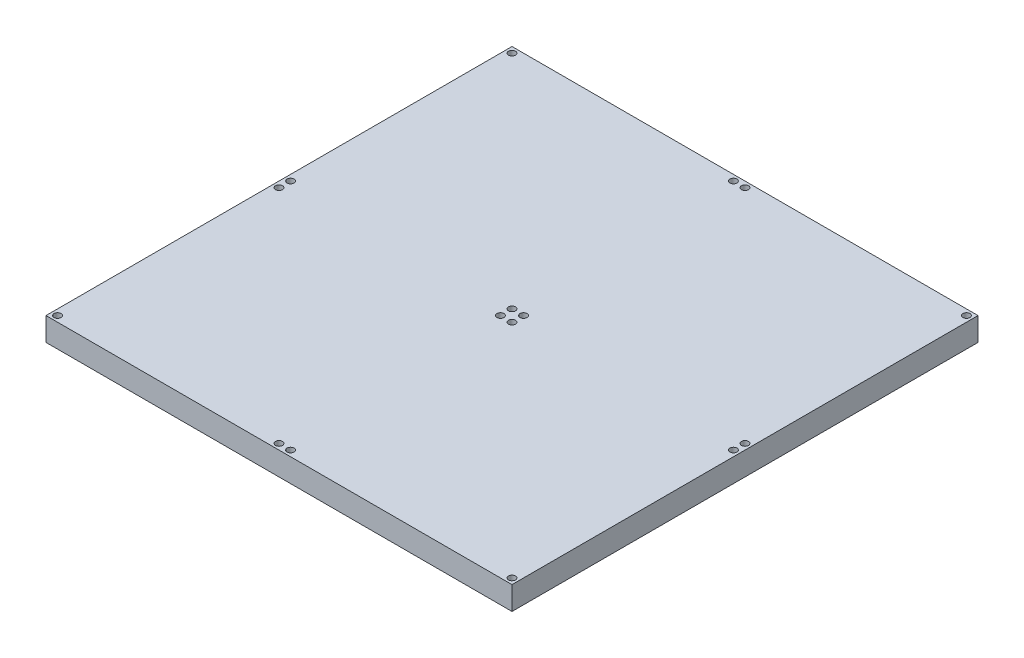
ISO-10303-21;
HEADER;
FILE_DESCRIPTION(('STEP AP214'),'2;1');
FILE_NAME('part.step','',(''),(''),'','','');
FILE_SCHEMA(('AUTOMOTIVE_DESIGN { 1 0 10303 214 1 1 1 1 }'));
ENDSEC;
DATA;
#1=APPLICATION_CONTEXT('core data for automotive mechanical design processes');
#2=APPLICATION_PROTOCOL_DEFINITION('international standard','automotive_design',2000,#1);
#3=PRODUCT_CONTEXT('',#1,'mechanical');
#4=PRODUCT('Part','Part','',(#3));
#5=PRODUCT_RELATED_PRODUCT_CATEGORY('part','',(#4));
#6=PRODUCT_DEFINITION_FORMATION('','',#4);
#7=PRODUCT_DEFINITION_CONTEXT('part definition',#1,'design');
#8=PRODUCT_DEFINITION('design','',#6,#7);
#9=PRODUCT_DEFINITION_SHAPE('','',#8);
#10=(LENGTH_UNIT() NAMED_UNIT(*) SI_UNIT(.MILLI.,.METRE.));
#11=(NAMED_UNIT(*) PLANE_ANGLE_UNIT() SI_UNIT($,.RADIAN.));
#12=(NAMED_UNIT(*) SI_UNIT($,.STERADIAN.) SOLID_ANGLE_UNIT());
#13=UNCERTAINTY_MEASURE_WITH_UNIT(LENGTH_MEASURE(1.E-05),#10,'distance_accuracy_value','');
#14=(GEOMETRIC_REPRESENTATION_CONTEXT(3) GLOBAL_UNCERTAINTY_ASSIGNED_CONTEXT((#13)) GLOBAL_UNIT_ASSIGNED_CONTEXT((#10,
#11,#12)) REPRESENTATION_CONTEXT('',''));
#15=CARTESIAN_POINT('',(0.,0.,0.));
#16=DIRECTION('',(0.,0.,1.));
#17=DIRECTION('',(1.,0.,0.));
#18=AXIS2_PLACEMENT_3D('',#15,#16,#17);
#19=CARTESIAN_POINT('',(74.9427641430503,2.54,74.9427641430503));
#20=DIRECTION('',(0.,1.,0.));
#21=DIRECTION('',(0.,0.,1.));
#22=AXIS2_PLACEMENT_3D('',#19,#20,#21);
#23=PLANE('',#22);
#24=CARTESIAN_POINT('',(74.9427641430503,2.54,74.9427641430503));
#25=DIRECTION('',(0.,1.,0.));
#26=DIRECTION('',(0.,0.,1.));
#27=AXIS2_PLACEMENT_3D('',#24,#25,#26);
#28=CIRCLE('',#27,0.761999999999999);
#29=CARTESIAN_POINT('',(74.9427641430503,2.54,75.7047641430503));
#30=VERTEX_POINT('',#29);
#31=EDGE_CURVE('E11',#30,#30,#28,.T.);
#32=ORIENTED_EDGE('',*,*,#31,.T.);
#33=EDGE_LOOP('',(#32));
#34=FACE_BOUND('',#33,.T.);
#35=ADVANCED_FACE('F39',(#34),#23,.T.);
#36=CARTESIAN_POINT('',(74.9427641430503,2.54,74.9427641430503));
#37=DIRECTION('',(0.,1.,0.));
#38=DIRECTION('',(0.,0.,1.));
#39=AXIS2_PLACEMENT_3D('',#36,#37,#38);
#40=CYLINDRICAL_SURFACE('',#39,0.761999999999999);
#41=ORIENTED_EDGE('',*,*,#31,.F.);
#42=EDGE_LOOP('',(#41));
#43=FACE_BOUND('',#42,.T.);
#44=CARTESIAN_POINT('',(74.9427641430503,5.08,74.9427641430503));
#45=DIRECTION('',(0.,1.,0.));
#46=DIRECTION('',(0.,0.,1.));
#47=AXIS2_PLACEMENT_3D('',#44,#45,#46);
#48=CIRCLE('',#47,0.761999999999999);
#49=CARTESIAN_POINT('',(74.9427641430503,5.08,75.7047641430503));
#50=VERTEX_POINT('',#49);
#51=EDGE_CURVE('E48',#50,#50,#48,.T.);
#52=ORIENTED_EDGE('',*,*,#51,.T.);
#53=EDGE_LOOP('',(#52));
#54=FACE_BOUND('',#53,.T.);
#55=ADVANCED_FACE('F225',(#43,#54),#40,.F.);
#56=CARTESIAN_POINT('',(74.9427641430503,2.54,24.1427641430503));
#57=DIRECTION('',(0.,1.,0.));
#58=DIRECTION('',(0.,0.,1.));
#59=AXIS2_PLACEMENT_3D('',#56,#57,#58);
#60=PLANE('',#59);
#61=CARTESIAN_POINT('',(74.9427641430503,2.54,24.1427641430503));
#62=DIRECTION('',(0.,1.,0.));
#63=DIRECTION('',(0.,0.,1.));
#64=AXIS2_PLACEMENT_3D('',#61,#62,#63);
#65=CIRCLE('',#64,0.761999999999999);
#66=CARTESIAN_POINT('',(74.9427641430503,2.54,24.9047641430503));
#67=VERTEX_POINT('',#66);
#68=EDGE_CURVE('E218',#67,#67,#65,.T.);
#69=ORIENTED_EDGE('',*,*,#68,.T.);
#70=EDGE_LOOP('',(#69));
#71=FACE_BOUND('',#70,.T.);
#72=ADVANCED_FACE('F250',(#71),#60,.T.);
#73=CARTESIAN_POINT('',(74.9427641430503,2.54,24.1427641430503));
#74=DIRECTION('',(0.,1.,0.));
#75=DIRECTION('',(0.,0.,1.));
#76=AXIS2_PLACEMENT_3D('',#73,#74,#75);
#77=CYLINDRICAL_SURFACE('',#76,0.761999999999999);
#78=ORIENTED_EDGE('',*,*,#68,.F.);
#79=EDGE_LOOP('',(#78));
#80=FACE_BOUND('',#79,.T.);
#81=CARTESIAN_POINT('',(74.9427641430503,5.08,24.1427641430503));
#82=DIRECTION('',(0.,1.,0.));
#83=DIRECTION('',(0.,0.,1.));
#84=AXIS2_PLACEMENT_3D('',#81,#82,#83);
#85=CIRCLE('',#84,0.761999999999999);
#86=CARTESIAN_POINT('',(74.9427641430503,5.08,24.9047641430503));
#87=VERTEX_POINT('',#86);
#88=EDGE_CURVE('E214',#87,#87,#85,.T.);
#89=ORIENTED_EDGE('',*,*,#88,.T.);
#90=EDGE_LOOP('',(#89));
#91=FACE_BOUND('',#90,.T.);
#92=ADVANCED_FACE('F256',(#80,#91),#77,.F.);
#93=CARTESIAN_POINT('',(26.6572358569497,2.54,74.9427641430503));
#94=DIRECTION('',(0.,-1.,0.));
#95=DIRECTION('',(0.,0.,-1.));
#96=AXIS2_PLACEMENT_3D('',#93,#94,#95);
#97=PLANE('',#96);
#98=CARTESIAN_POINT('',(26.6572358569497,2.54,74.9427641430503));
#99=DIRECTION('',(0.,1.,0.));
#100=DIRECTION('',(0.,0.,-1.));
#101=AXIS2_PLACEMENT_3D('',#98,#99,#100);
#102=CIRCLE('',#101,0.761999999999999);
#103=CARTESIAN_POINT('',(26.6572358569497,2.54,74.1807641430503));
#104=VERTEX_POINT('',#103);
#105=EDGE_CURVE('E210',#104,#104,#102,.T.);
#106=ORIENTED_EDGE('',*,*,#105,.T.);
#107=EDGE_LOOP('',(#106));
#108=FACE_BOUND('',#107,.T.);
#109=ADVANCED_FACE('F262',(#108),#97,.F.);
#110=CARTESIAN_POINT('',(26.6572358569497,2.54,74.9427641430503));
#111=DIRECTION('',(0.,1.,0.));
#112=DIRECTION('',(0.,0.,1.));
#113=AXIS2_PLACEMENT_3D('',#110,#111,#112);
#114=CYLINDRICAL_SURFACE('',#113,0.761999999999999);
#115=ORIENTED_EDGE('',*,*,#105,.F.);
#116=EDGE_LOOP('',(#115));
#117=FACE_BOUND('',#116,.T.);
#118=CARTESIAN_POINT('',(26.6572358569497,5.08,74.9427641430503));
#119=DIRECTION('',(0.,1.,0.));
#120=DIRECTION('',(0.,0.,-1.));
#121=AXIS2_PLACEMENT_3D('',#118,#119,#120);
#122=CIRCLE('',#121,0.761999999999999);
#123=CARTESIAN_POINT('',(26.6572358569497,5.08,74.1807641430503));
#124=VERTEX_POINT('',#123);
#125=EDGE_CURVE('E206',#124,#124,#122,.T.);
#126=ORIENTED_EDGE('',*,*,#125,.T.);
#127=EDGE_LOOP('',(#126));
#128=FACE_BOUND('',#127,.T.);
#129=ADVANCED_FACE('F266',(#117,#128),#114,.F.);
#130=CARTESIAN_POINT('',(26.6572358569497,2.54,24.1427641430503));
#131=DIRECTION('',(0.,-1.,0.));
#132=DIRECTION('',(0.,0.,-1.));
#133=AXIS2_PLACEMENT_3D('',#130,#131,#132);
#134=PLANE('',#133);
#135=CARTESIAN_POINT('',(26.6572358569497,2.54,24.1427641430503));
#136=DIRECTION('',(0.,1.,0.));
#137=DIRECTION('',(0.,0.,-1.));
#138=AXIS2_PLACEMENT_3D('',#135,#136,#137);
#139=CIRCLE('',#138,0.761999999999999);
#140=CARTESIAN_POINT('',(26.6572358569497,2.54,23.3807641430503));
#141=VERTEX_POINT('',#140);
#142=EDGE_CURVE('E202',#141,#141,#139,.T.);
#143=ORIENTED_EDGE('',*,*,#142,.T.);
#144=EDGE_LOOP('',(#143));
#145=FACE_BOUND('',#144,.T.);
#146=ADVANCED_FACE('F270',(#145),#134,.F.);
#147=CARTESIAN_POINT('',(26.6572358569497,2.54,24.1427641430503));
#148=DIRECTION('',(0.,1.,0.));
#149=DIRECTION('',(0.,0.,1.));
#150=AXIS2_PLACEMENT_3D('',#147,#148,#149);
#151=CYLINDRICAL_SURFACE('',#150,0.761999999999999);
#152=ORIENTED_EDGE('',*,*,#142,.F.);
#153=EDGE_LOOP('',(#152));
#154=FACE_BOUND('',#153,.T.);
#155=CARTESIAN_POINT('',(26.6572358569497,5.08,24.1427641430503));
#156=DIRECTION('',(0.,1.,0.));
#157=DIRECTION('',(0.,0.,-1.));
#158=AXIS2_PLACEMENT_3D('',#155,#156,#157);
#159=CIRCLE('',#158,0.761999999999999);
#160=CARTESIAN_POINT('',(26.6572358569497,5.08,23.3807641430503));
#161=VERTEX_POINT('',#160);
#162=EDGE_CURVE('E198',#161,#161,#159,.T.);
#163=ORIENTED_EDGE('',*,*,#162,.T.);
#164=EDGE_LOOP('',(#163));
#165=FACE_BOUND('',#164,.T.);
#166=ADVANCED_FACE('F274',(#154,#165),#151,.F.);
#167=CARTESIAN_POINT('',(74.9427641430503,2.54,26.6572358569497));
#168=DIRECTION('',(0.,-1.,0.));
#169=DIRECTION('',(0.,0.,-1.));
#170=AXIS2_PLACEMENT_3D('',#167,#168,#169);
#171=PLANE('',#170);
#172=CARTESIAN_POINT('',(74.9427641430503,2.54,26.6572358569497));
#173=DIRECTION('',(0.,1.,0.));
#174=DIRECTION('',(0.,0.,-1.));
#175=AXIS2_PLACEMENT_3D('',#172,#173,#174);
#176=CIRCLE('',#175,0.761999999999999);
#177=CARTESIAN_POINT('',(74.9427641430503,2.54,25.8952358569497));
#178=VERTEX_POINT('',#177);
#179=EDGE_CURVE('E194',#178,#178,#176,.T.);
#180=ORIENTED_EDGE('',*,*,#179,.T.);
#181=EDGE_LOOP('',(#180));
#182=FACE_BOUND('',#181,.T.);
#183=ADVANCED_FACE('F278',(#182),#171,.F.);
#184=CARTESIAN_POINT('',(74.9427641430503,2.54,26.6572358569497));
#185=DIRECTION('',(0.,1.,0.));
#186=DIRECTION('',(0.,0.,1.));
#187=AXIS2_PLACEMENT_3D('',#184,#185,#186);
#188=CYLINDRICAL_SURFACE('',#187,0.761999999999999);
#189=ORIENTED_EDGE('',*,*,#179,.F.);
#190=EDGE_LOOP('',(#189));
#191=FACE_BOUND('',#190,.T.);
#192=CARTESIAN_POINT('',(74.9427641430503,5.08,26.6572358569497));
#193=DIRECTION('',(0.,1.,0.));
#194=DIRECTION('',(0.,0.,-1.));
#195=AXIS2_PLACEMENT_3D('',#192,#193,#194);
#196=CIRCLE('',#195,0.761999999999999);
#197=CARTESIAN_POINT('',(74.9427641430503,5.08,25.8952358569497));
#198=VERTEX_POINT('',#197);
#199=EDGE_CURVE('E190',#198,#198,#196,.T.);
#200=ORIENTED_EDGE('',*,*,#199,.T.);
#201=EDGE_LOOP('',(#200));
#202=FACE_BOUND('',#201,.T.);
#203=ADVANCED_FACE('F282',(#191,#202),#188,.F.);
#204=CARTESIAN_POINT('',(74.9427641430503,2.54,-24.1427641430503));
#205=DIRECTION('',(0.,-1.,0.));
#206=DIRECTION('',(0.,0.,-1.));
#207=AXIS2_PLACEMENT_3D('',#204,#205,#206);
#208=PLANE('',#207);
#209=CARTESIAN_POINT('',(74.9427641430503,2.54,-24.1427641430503));
#210=DIRECTION('',(0.,1.,0.));
#211=DIRECTION('',(0.,0.,-1.));
#212=AXIS2_PLACEMENT_3D('',#209,#210,#211);
#213=CIRCLE('',#212,0.761999999999999);
#214=CARTESIAN_POINT('',(74.9427641430503,2.54,-24.9047641430503));
#215=VERTEX_POINT('',#214);
#216=EDGE_CURVE('E186',#215,#215,#213,.T.);
#217=ORIENTED_EDGE('',*,*,#216,.T.);
#218=EDGE_LOOP('',(#217));
#219=FACE_BOUND('',#218,.T.);
#220=ADVANCED_FACE('F286',(#219),#208,.F.);
#221=CARTESIAN_POINT('',(74.9427641430503,2.54,-24.1427641430503));
#222=DIRECTION('',(0.,1.,0.));
#223=DIRECTION('',(0.,0.,1.));
#224=AXIS2_PLACEMENT_3D('',#221,#222,#223);
#225=CYLINDRICAL_SURFACE('',#224,0.761999999999999);
#226=ORIENTED_EDGE('',*,*,#216,.F.);
#227=EDGE_LOOP('',(#226));
#228=FACE_BOUND('',#227,.T.);
#229=CARTESIAN_POINT('',(74.9427641430503,5.08,-24.1427641430503));
#230=DIRECTION('',(0.,1.,0.));
#231=DIRECTION('',(0.,0.,-1.));
#232=AXIS2_PLACEMENT_3D('',#229,#230,#231);
#233=CIRCLE('',#232,0.761999999999999);
#234=CARTESIAN_POINT('',(74.9427641430503,5.08,-24.9047641430503));
#235=VERTEX_POINT('',#234);
#236=EDGE_CURVE('E182',#235,#235,#233,.T.);
#237=ORIENTED_EDGE('',*,*,#236,.T.);
#238=EDGE_LOOP('',(#237));
#239=FACE_BOUND('',#238,.T.);
#240=ADVANCED_FACE('F290',(#228,#239),#225,.F.);
#241=CARTESIAN_POINT('',(26.6572358569497,2.54,26.6572358569497));
#242=DIRECTION('',(0.,1.,0.));
#243=DIRECTION('',(0.,0.,1.));
#244=AXIS2_PLACEMENT_3D('',#241,#242,#243);
#245=PLANE('',#244);
#246=CARTESIAN_POINT('',(26.6572358569497,2.54,26.6572358569497));
#247=DIRECTION('',(0.,1.,0.));
#248=DIRECTION('',(0.,0.,1.));
#249=AXIS2_PLACEMENT_3D('',#246,#247,#248);
#250=CIRCLE('',#249,0.761999999999999);
#251=CARTESIAN_POINT('',(26.6572358569497,2.54,27.4192358569497));
#252=VERTEX_POINT('',#251);
#253=EDGE_CURVE('E178',#252,#252,#250,.T.);
#254=ORIENTED_EDGE('',*,*,#253,.T.);
#255=EDGE_LOOP('',(#254));
#256=FACE_BOUND('',#255,.T.);
#257=ADVANCED_FACE('F294',(#256),#245,.T.);
#258=CARTESIAN_POINT('',(26.6572358569497,2.54,26.6572358569497));
#259=DIRECTION('',(0.,1.,0.));
#260=DIRECTION('',(0.,0.,1.));
#261=AXIS2_PLACEMENT_3D('',#258,#259,#260);
#262=CYLINDRICAL_SURFACE('',#261,0.761999999999999);
#263=ORIENTED_EDGE('',*,*,#253,.F.);
#264=EDGE_LOOP('',(#263));
#265=FACE_BOUND('',#264,.T.);
#266=CARTESIAN_POINT('',(26.6572358569497,5.08,26.6572358569497));
#267=DIRECTION('',(0.,1.,0.));
#268=DIRECTION('',(0.,0.,1.));
#269=AXIS2_PLACEMENT_3D('',#266,#267,#268);
#270=CIRCLE('',#269,0.761999999999999);
#271=CARTESIAN_POINT('',(26.6572358569497,5.08,27.4192358569497));
#272=VERTEX_POINT('',#271);
#273=EDGE_CURVE('E174',#272,#272,#270,.T.);
#274=ORIENTED_EDGE('',*,*,#273,.T.);
#275=EDGE_LOOP('',(#274));
#276=FACE_BOUND('',#275,.T.);
#277=ADVANCED_FACE('F298',(#265,#276),#262,.F.);
#278=CARTESIAN_POINT('',(26.6572358569497,2.54,-24.1427641430503));
#279=DIRECTION('',(0.,1.,0.));
#280=DIRECTION('',(0.,0.,1.));
#281=AXIS2_PLACEMENT_3D('',#278,#279,#280);
#282=PLANE('',#281);
#283=CARTESIAN_POINT('',(26.6572358569497,2.54,-24.1427641430503));
#284=DIRECTION('',(0.,1.,0.));
#285=DIRECTION('',(0.,0.,1.));
#286=AXIS2_PLACEMENT_3D('',#283,#284,#285);
#287=CIRCLE('',#286,0.761999999999999);
#288=CARTESIAN_POINT('',(26.6572358569497,2.54,-23.3807641430503));
#289=VERTEX_POINT('',#288);
#290=EDGE_CURVE('E170',#289,#289,#287,.T.);
#291=ORIENTED_EDGE('',*,*,#290,.T.);
#292=EDGE_LOOP('',(#291));
#293=FACE_BOUND('',#292,.T.);
#294=ADVANCED_FACE('F302',(#293),#282,.T.);
#295=CARTESIAN_POINT('',(26.6572358569497,2.54,-24.1427641430503));
#296=DIRECTION('',(0.,1.,0.));
#297=DIRECTION('',(0.,0.,1.));
#298=AXIS2_PLACEMENT_3D('',#295,#296,#297);
#299=CYLINDRICAL_SURFACE('',#298,0.761999999999999);
#300=ORIENTED_EDGE('',*,*,#290,.F.);
#301=EDGE_LOOP('',(#300));
#302=FACE_BOUND('',#301,.T.);
#303=CARTESIAN_POINT('',(26.6572358569497,5.08,-24.1427641430503));
#304=DIRECTION('',(0.,1.,0.));
#305=DIRECTION('',(0.,0.,1.));
#306=AXIS2_PLACEMENT_3D('',#303,#304,#305);
#307=CIRCLE('',#306,0.761999999999999);
#308=CARTESIAN_POINT('',(26.6572358569497,5.08,-23.3807641430503));
#309=VERTEX_POINT('',#308);
#310=EDGE_CURVE('E166',#309,#309,#307,.T.);
#311=ORIENTED_EDGE('',*,*,#310,.T.);
#312=EDGE_LOOP('',(#311));
#313=FACE_BOUND('',#312,.T.);
#314=ADVANCED_FACE('F306',(#302,#313),#299,.F.);
#315=CARTESIAN_POINT('',(-25.4,5.08,-25.4));
#316=DIRECTION('',(0.,0.,1.));
#317=DIRECTION('',(1.,0.,0.));
#318=AXIS2_PLACEMENT_3D('',#315,#316,#317);
#319=PLANE('',#318);
#320=DIRECTION('',(-1.,0.,0.));
#321=VECTOR('',#320,1.);
#322=CARTESIAN_POINT('',(-25.4,0.,-25.4));
#323=LINE('',#322,#321);
#324=CARTESIAN_POINT('',(76.2,0.,-25.4));
#325=VERTEX_POINT('',#324);
#326=CARTESIAN_POINT('',(-25.4,0.,-25.4));
#327=VERTEX_POINT('',#326);
#328=EDGE_CURVE('E149',#325,#327,#323,.T.);
#329=ORIENTED_EDGE('',*,*,#328,.T.);
#330=DIRECTION('',(0.,-1.,0.));
#331=VECTOR('',#330,1.);
#332=CARTESIAN_POINT('',(-25.4,5.08,-25.4));
#333=LINE('',#332,#331);
#334=CARTESIAN_POINT('',(-25.4,5.08,-25.4));
#335=VERTEX_POINT('',#334);
#336=EDGE_CURVE('E158',#335,#327,#333,.T.);
#337=ORIENTED_EDGE('',*,*,#336,.F.);
#338=DIRECTION('',(-1.,0.,0.));
#339=VECTOR('',#338,1.);
#340=CARTESIAN_POINT('',(-25.4,5.08,-25.4));
#341=LINE('',#340,#339);
#342=CARTESIAN_POINT('',(76.2,5.08,-25.4));
#343=VERTEX_POINT('',#342);
#344=EDGE_CURVE('E54',#343,#335,#341,.T.);
#345=ORIENTED_EDGE('',*,*,#344,.F.);
#346=DIRECTION('',(0.,-1.,0.));
#347=VECTOR('',#346,1.);
#348=CARTESIAN_POINT('',(76.2,5.08,-25.4));
#349=LINE('',#348,#347);
#350=EDGE_CURVE('E83',#343,#325,#349,.T.);
#351=ORIENTED_EDGE('',*,*,#350,.T.);
#352=EDGE_LOOP('',(#329,#337,#345,#351));
#353=FACE_BOUND('',#352,.T.);
#354=ADVANCED_FACE('F239',(#353),#319,.F.);
#355=CARTESIAN_POINT('',(-25.4,5.08,25.4));
#356=DIRECTION('',(1.,0.,0.));
#357=DIRECTION('',(0.,0.,-1.));
#358=AXIS2_PLACEMENT_3D('',#355,#356,#357);
#359=PLANE('',#358);
#360=DIRECTION('',(0.,0.,1.));
#361=VECTOR('',#360,1.);
#362=CARTESIAN_POINT('',(-25.4,0.,25.4));
#363=LINE('',#362,#361);
#364=CARTESIAN_POINT('',(-25.4,0.,76.2));
#365=VERTEX_POINT('',#364);
#366=EDGE_CURVE('E155',#327,#365,#363,.T.);
#367=ORIENTED_EDGE('',*,*,#366,.T.);
#368=DIRECTION('',(0.,-1.,0.));
#369=VECTOR('',#368,1.);
#370=CARTESIAN_POINT('',(-25.4,5.08,76.2));
#371=LINE('',#370,#369);
#372=CARTESIAN_POINT('',(-25.4,5.08,76.2));
#373=VERTEX_POINT('',#372);
#374=EDGE_CURVE('E97',#373,#365,#371,.T.);
#375=ORIENTED_EDGE('',*,*,#374,.F.);
#376=DIRECTION('',(0.,0.,1.));
#377=VECTOR('',#376,1.);
#378=CARTESIAN_POINT('',(-25.4,5.08,25.4));
#379=LINE('',#378,#377);
#380=EDGE_CURVE('E92',#335,#373,#379,.T.);
#381=ORIENTED_EDGE('',*,*,#380,.F.);
#382=ORIENTED_EDGE('',*,*,#336,.T.);
#383=EDGE_LOOP('',(#367,#375,#381,#382));
#384=FACE_BOUND('',#383,.T.);
#385=ADVANCED_FACE('F229',(#384),#359,.F.);
#386=CARTESIAN_POINT('',(0.,5.08,0.));
#387=DIRECTION('',(0.,-1.,0.));
#388=DIRECTION('',(0.,0.,-1.));
#389=AXIS2_PLACEMENT_3D('',#386,#387,#388);
#390=PLANE('',#389);
#391=CARTESIAN_POINT('',(24.1427641430503,5.08,74.9427641430503));
#392=DIRECTION('',(0.,1.,0.));
#393=DIRECTION('',(0.,0.,1.));
#394=AXIS2_PLACEMENT_3D('',#391,#392,#393);
#395=CIRCLE('',#394,0.761999999999999);
#396=CARTESIAN_POINT('',(24.1427641430503,5.08,75.7047641430503));
#397=VERTEX_POINT('',#396);
#398=EDGE_CURVE('E655',#397,#397,#395,.T.);
#399=ORIENTED_EDGE('',*,*,#398,.F.);
#400=EDGE_LOOP('',(#399));
#401=FACE_BOUND('',#400,.T.);
#402=CARTESIAN_POINT('',(-24.1427641430503,5.08,74.9427641430503));
#403=DIRECTION('',(0.,1.,0.));
#404=DIRECTION('',(0.,0.,-1.));
#405=AXIS2_PLACEMENT_3D('',#402,#403,#404);
#406=CIRCLE('',#405,0.761999999999999);
#407=CARTESIAN_POINT('',(-24.1427641430503,5.08,74.1807641430503));
#408=VERTEX_POINT('',#407);
#409=EDGE_CURVE('E654',#408,#408,#406,.T.);
#410=ORIENTED_EDGE('',*,*,#409,.F.);
#411=EDGE_LOOP('',(#410));
#412=FACE_BOUND('',#411,.T.);
#413=CARTESIAN_POINT('',(24.1427641430503,5.08,26.6572358569497));
#414=DIRECTION('',(0.,1.,0.));
#415=DIRECTION('',(0.,0.,-1.));
#416=AXIS2_PLACEMENT_3D('',#413,#414,#415);
#417=CIRCLE('',#416,0.761999999999999);
#418=CARTESIAN_POINT('',(24.1427641430503,5.08,25.8952358569497));
#419=VERTEX_POINT('',#418);
#420=EDGE_CURVE('E668',#419,#419,#417,.T.);
#421=ORIENTED_EDGE('',*,*,#420,.F.);
#422=EDGE_LOOP('',(#421));
#423=FACE_BOUND('',#422,.T.);
#424=CARTESIAN_POINT('',(-24.1427641430503,5.08,26.6572358569497));
#425=DIRECTION('',(0.,1.,0.));
#426=DIRECTION('',(0.,0.,1.));
#427=AXIS2_PLACEMENT_3D('',#424,#425,#426);
#428=CIRCLE('',#427,0.761999999999999);
#429=CARTESIAN_POINT('',(-24.1427641430503,5.08,27.4192358569497));
#430=VERTEX_POINT('',#429);
#431=EDGE_CURVE('E110',#430,#430,#428,.T.);
#432=ORIENTED_EDGE('',*,*,#431,.F.);
#433=EDGE_LOOP('',(#432));
#434=FACE_BOUND('',#433,.T.);
#435=DIRECTION('',(0.,0.,-1.));
#436=VECTOR('',#435,1.);
#437=CARTESIAN_POINT('',(76.2,5.08,25.4));
#438=LINE('',#437,#436);
#439=CARTESIAN_POINT('',(76.2,5.08,76.2));
#440=VERTEX_POINT('',#439);
#441=EDGE_CURVE('E76',#440,#343,#438,.T.);
#442=ORIENTED_EDGE('',*,*,#441,.T.);
#443=ORIENTED_EDGE('',*,*,#344,.T.);
#444=ORIENTED_EDGE('',*,*,#380,.T.);
#445=DIRECTION('',(1.,0.,0.));
#446=VECTOR('',#445,1.);
#447=CARTESIAN_POINT('',(-25.4,5.08,76.2));
#448=LINE('',#447,#446);
#449=EDGE_CURVE('E88',#373,#440,#448,.T.);
#450=ORIENTED_EDGE('',*,*,#449,.T.);
#451=EDGE_LOOP('',(#442,#443,#444,#450));
#452=FACE_BOUND('',#451,.T.);
#453=CARTESIAN_POINT('',(-24.1427641430503,5.08,-24.1427641430503));
#454=DIRECTION('',(0.,1.,0.));
#455=DIRECTION('',(0.,0.,1.));
#456=AXIS2_PLACEMENT_3D('',#453,#454,#455);
#457=CIRCLE('',#456,0.761999999999999);
#458=CARTESIAN_POINT('',(-24.1427641430503,5.08,-23.3807641430503));
#459=VERTEX_POINT('',#458);
#460=EDGE_CURVE('E134',#459,#459,#457,.T.);
#461=ORIENTED_EDGE('',*,*,#460,.F.);
#462=EDGE_LOOP('',(#461));
#463=FACE_BOUND('',#462,.T.);
#464=CARTESIAN_POINT('',(24.1427641430503,5.08,24.1427641430503));
#465=DIRECTION('',(0.,1.,0.));
#466=DIRECTION('',(0.,0.,1.));
#467=AXIS2_PLACEMENT_3D('',#464,#465,#466);
#468=CIRCLE('',#467,0.761999999999999);
#469=CARTESIAN_POINT('',(24.1427641430503,5.08,24.9047641430503));
#470=VERTEX_POINT('',#469);
#471=EDGE_CURVE('E125',#470,#470,#468,.T.);
#472=ORIENTED_EDGE('',*,*,#471,.F.);
#473=EDGE_LOOP('',(#472));
#474=FACE_BOUND('',#473,.T.);
#475=CARTESIAN_POINT('',(-24.1427641430503,5.08,24.1427641430503));
#476=DIRECTION('',(0.,1.,0.));
#477=DIRECTION('',(0.,0.,-1.));
#478=AXIS2_PLACEMENT_3D('',#475,#476,#477);
#479=CIRCLE('',#478,0.761999999999999);
#480=CARTESIAN_POINT('',(-24.1427641430503,5.08,23.3807641430503));
#481=VERTEX_POINT('',#480);
#482=EDGE_CURVE('E120',#481,#481,#479,.T.);
#483=ORIENTED_EDGE('',*,*,#482,.F.);
#484=EDGE_LOOP('',(#483));
#485=FACE_BOUND('',#484,.T.);
#486=CARTESIAN_POINT('',(24.1427641430503,5.08,-24.1427641430503));
#487=DIRECTION('',(0.,1.,0.));
#488=DIRECTION('',(0.,0.,-1.));
#489=AXIS2_PLACEMENT_3D('',#486,#487,#488);
#490=CIRCLE('',#489,0.761999999999999);
#491=CARTESIAN_POINT('',(24.1427641430503,5.08,-24.9047641430503));
#492=VERTEX_POINT('',#491);
#493=EDGE_CURVE('E133',#492,#492,#490,.T.);
#494=ORIENTED_EDGE('',*,*,#493,.F.);
#495=EDGE_LOOP('',(#494));
#496=FACE_BOUND('',#495,.T.);
#497=ORIENTED_EDGE('',*,*,#310,.F.);
#498=EDGE_LOOP('',(#497));
#499=FACE_BOUND('',#498,.T.);
#500=ORIENTED_EDGE('',*,*,#273,.F.);
#501=EDGE_LOOP('',(#500));
#502=FACE_BOUND('',#501,.T.);
#503=ORIENTED_EDGE('',*,*,#236,.F.);
#504=EDGE_LOOP('',(#503));
#505=FACE_BOUND('',#504,.T.);
#506=ORIENTED_EDGE('',*,*,#199,.F.);
#507=EDGE_LOOP('',(#506));
#508=FACE_BOUND('',#507,.T.);
#509=ORIENTED_EDGE('',*,*,#162,.F.);
#510=EDGE_LOOP('',(#509));
#511=FACE_BOUND('',#510,.T.);
#512=ORIENTED_EDGE('',*,*,#125,.F.);
#513=EDGE_LOOP('',(#512));
#514=FACE_BOUND('',#513,.T.);
#515=ORIENTED_EDGE('',*,*,#88,.F.);
#516=EDGE_LOOP('',(#515));
#517=FACE_BOUND('',#516,.T.);
#518=ORIENTED_EDGE('',*,*,#51,.F.);
#519=EDGE_LOOP('',(#518));
#520=FACE_BOUND('',#519,.T.);
#521=ADVANCED_FACE('F89',(#401,#412,#423,#434,#452,#463,#474,#485,#496,#499,#502,#505,#508,#511,
#514,#517,#520),#390,.F.);
#522=CARTESIAN_POINT('',(0.,0.,0.));
#523=DIRECTION('',(0.,-1.,0.));
#524=DIRECTION('',(0.,0.,-1.));
#525=AXIS2_PLACEMENT_3D('',#522,#523,#524);
#526=PLANE('',#525);
#527=ORIENTED_EDGE('',*,*,#328,.F.);
#528=DIRECTION('',(0.,0.,-1.));
#529=VECTOR('',#528,1.);
#530=CARTESIAN_POINT('',(76.2,0.,25.4));
#531=LINE('',#530,#529);
#532=CARTESIAN_POINT('',(76.2,0.,76.2));
#533=VERTEX_POINT('',#532);
#534=EDGE_CURVE('E85',#533,#325,#531,.T.);
#535=ORIENTED_EDGE('',*,*,#534,.F.);
#536=DIRECTION('',(1.,0.,0.));
#537=VECTOR('',#536,1.);
#538=CARTESIAN_POINT('',(-25.4,0.,76.2));
#539=LINE('',#538,#537);
#540=EDGE_CURVE('E98',#365,#533,#539,.T.);
#541=ORIENTED_EDGE('',*,*,#540,.F.);
#542=ORIENTED_EDGE('',*,*,#366,.F.);
#543=EDGE_LOOP('',(#527,#535,#541,#542));
#544=FACE_BOUND('',#543,.T.);
#545=ADVANCED_FACE('F228',(#544),#526,.T.);
#546=CARTESIAN_POINT('',(24.1427641430503,2.54,-24.1427641430503));
#547=DIRECTION('',(0.,1.,0.));
#548=DIRECTION('',(0.,0.,1.));
#549=AXIS2_PLACEMENT_3D('',#546,#547,#548);
#550=CYLINDRICAL_SURFACE('',#549,0.761999999999999);
#551=CARTESIAN_POINT('',(24.1427641430503,2.54,-24.1427641430503));
#552=DIRECTION('',(0.,1.,0.));
#553=DIRECTION('',(0.,0.,-1.));
#554=AXIS2_PLACEMENT_3D('',#551,#552,#553);
#555=CIRCLE('',#554,0.761999999999999);
#556=CARTESIAN_POINT('',(24.1427641430503,2.54,-24.9047641430503));
#557=VERTEX_POINT('',#556);
#558=EDGE_CURVE('E145',#557,#557,#555,.T.);
#559=ORIENTED_EDGE('',*,*,#558,.F.);
#560=EDGE_LOOP('',(#559));
#561=FACE_BOUND('',#560,.T.);
#562=ORIENTED_EDGE('',*,*,#493,.T.);
#563=EDGE_LOOP('',(#562));
#564=FACE_BOUND('',#563,.T.);
#565=ADVANCED_FACE('F236',(#561,#564),#550,.F.);
#566=CARTESIAN_POINT('',(24.1427641430503,2.54,-24.1427641430503));
#567=DIRECTION('',(0.,-1.,0.));
#568=DIRECTION('',(0.,0.,-1.));
#569=AXIS2_PLACEMENT_3D('',#566,#567,#568);
#570=PLANE('',#569);
#571=ORIENTED_EDGE('',*,*,#558,.T.);
#572=EDGE_LOOP('',(#571));
#573=FACE_BOUND('',#572,.T.);
#574=ADVANCED_FACE('F450',(#573),#570,.F.);
#575=CARTESIAN_POINT('',(-24.1427641430503,2.54,24.1427641430503));
#576=DIRECTION('',(0.,1.,0.));
#577=DIRECTION('',(0.,0.,1.));
#578=AXIS2_PLACEMENT_3D('',#575,#576,#577);
#579=CYLINDRICAL_SURFACE('',#578,0.761999999999999);
#580=CARTESIAN_POINT('',(-24.1427641430503,2.54,24.1427641430503));
#581=DIRECTION('',(0.,1.,0.));
#582=DIRECTION('',(0.,0.,-1.));
#583=AXIS2_PLACEMENT_3D('',#580,#581,#582);
#584=CIRCLE('',#583,0.761999999999999);
#585=CARTESIAN_POINT('',(-24.1427641430503,2.54,23.3807641430503));
#586=VERTEX_POINT('',#585);
#587=EDGE_CURVE('E121',#586,#586,#584,.T.);
#588=ORIENTED_EDGE('',*,*,#587,.F.);
#589=EDGE_LOOP('',(#588));
#590=FACE_BOUND('',#589,.T.);
#591=ORIENTED_EDGE('',*,*,#482,.T.);
#592=EDGE_LOOP('',(#591));
#593=FACE_BOUND('',#592,.T.);
#594=ADVANCED_FACE('F446',(#590,#593),#579,.F.);
#595=CARTESIAN_POINT('',(-24.1427641430503,2.54,24.1427641430503));
#596=DIRECTION('',(0.,-1.,0.));
#597=DIRECTION('',(0.,0.,-1.));
#598=AXIS2_PLACEMENT_3D('',#595,#596,#597);
#599=PLANE('',#598);
#600=ORIENTED_EDGE('',*,*,#587,.T.);
#601=EDGE_LOOP('',(#600));
#602=FACE_BOUND('',#601,.T.);
#603=ADVANCED_FACE('F442',(#602),#599,.F.);
#604=CARTESIAN_POINT('',(24.1427641430503,2.54,24.1427641430503));
#605=DIRECTION('',(0.,1.,0.));
#606=DIRECTION('',(0.,0.,1.));
#607=AXIS2_PLACEMENT_3D('',#604,#605,#606);
#608=CYLINDRICAL_SURFACE('',#607,0.761999999999999);
#609=CARTESIAN_POINT('',(24.1427641430503,2.54,24.1427641430503));
#610=DIRECTION('',(0.,1.,0.));
#611=DIRECTION('',(0.,0.,1.));
#612=AXIS2_PLACEMENT_3D('',#609,#610,#611);
#613=CIRCLE('',#612,0.761999999999999);
#614=CARTESIAN_POINT('',(24.1427641430503,2.54,24.9047641430503));
#615=VERTEX_POINT('',#614);
#616=EDGE_CURVE('E138',#615,#615,#613,.T.);
#617=ORIENTED_EDGE('',*,*,#616,.F.);
#618=EDGE_LOOP('',(#617));
#619=FACE_BOUND('',#618,.T.);
#620=ORIENTED_EDGE('',*,*,#471,.T.);
#621=EDGE_LOOP('',(#620));
#622=FACE_BOUND('',#621,.T.);
#623=ADVANCED_FACE('F445',(#619,#622),#608,.F.);
#624=CARTESIAN_POINT('',(24.1427641430503,2.54,24.1427641430503));
#625=DIRECTION('',(0.,1.,0.));
#626=DIRECTION('',(0.,0.,1.));
#627=AXIS2_PLACEMENT_3D('',#624,#625,#626);
#628=PLANE('',#627);
#629=ORIENTED_EDGE('',*,*,#616,.T.);
#630=EDGE_LOOP('',(#629));
#631=FACE_BOUND('',#630,.T.);
#632=ADVANCED_FACE('F457',(#631),#628,.T.);
#633=CARTESIAN_POINT('',(-24.1427641430503,2.54,-24.1427641430503));
#634=DIRECTION('',(0.,1.,0.));
#635=DIRECTION('',(0.,0.,1.));
#636=AXIS2_PLACEMENT_3D('',#633,#634,#635);
#637=CYLINDRICAL_SURFACE('',#636,0.761999999999999);
#638=CARTESIAN_POINT('',(-24.1427641430503,2.54,-24.1427641430503));
#639=DIRECTION('',(0.,1.,0.));
#640=DIRECTION('',(0.,0.,1.));
#641=AXIS2_PLACEMENT_3D('',#638,#639,#640);
#642=CIRCLE('',#641,0.761999999999999);
#643=CARTESIAN_POINT('',(-24.1427641430503,2.54,-23.3807641430503));
#644=VERTEX_POINT('',#643);
#645=EDGE_CURVE('E129',#644,#644,#642,.T.);
#646=ORIENTED_EDGE('',*,*,#645,.F.);
#647=EDGE_LOOP('',(#646));
#648=FACE_BOUND('',#647,.T.);
#649=ORIENTED_EDGE('',*,*,#460,.T.);
#650=EDGE_LOOP('',(#649));
#651=FACE_BOUND('',#650,.T.);
#652=ADVANCED_FACE('F453',(#648,#651),#637,.F.);
#653=CARTESIAN_POINT('',(-24.1427641430503,2.54,-24.1427641430503));
#654=DIRECTION('',(0.,1.,0.));
#655=DIRECTION('',(0.,0.,1.));
#656=AXIS2_PLACEMENT_3D('',#653,#654,#655);
#657=PLANE('',#656);
#658=ORIENTED_EDGE('',*,*,#645,.T.);
#659=EDGE_LOOP('',(#658));
#660=FACE_BOUND('',#659,.T.);
#661=ADVANCED_FACE('F345',(#660),#657,.T.);
#662=CARTESIAN_POINT('',(76.2,5.08,25.4));
#663=DIRECTION('',(-1.,0.,0.));
#664=DIRECTION('',(0.,0.,1.));
#665=AXIS2_PLACEMENT_3D('',#662,#663,#664);
#666=PLANE('',#665);
#667=ORIENTED_EDGE('',*,*,#534,.T.);
#668=ORIENTED_EDGE('',*,*,#350,.F.);
#669=ORIENTED_EDGE('',*,*,#441,.F.);
#670=DIRECTION('',(0.,-1.,0.));
#671=VECTOR('',#670,1.);
#672=CARTESIAN_POINT('',(76.2,5.08,76.2));
#673=LINE('',#672,#671);
#674=EDGE_CURVE('E81',#440,#533,#673,.T.);
#675=ORIENTED_EDGE('',*,*,#674,.T.);
#676=EDGE_LOOP('',(#667,#668,#669,#675));
#677=FACE_BOUND('',#676,.T.);
#678=ADVANCED_FACE('F79',(#677),#666,.F.);
#679=CARTESIAN_POINT('',(-25.4,5.08,76.2));
#680=DIRECTION('',(0.,0.,-1.));
#681=DIRECTION('',(-1.,0.,0.));
#682=AXIS2_PLACEMENT_3D('',#679,#680,#681);
#683=PLANE('',#682);
#684=ORIENTED_EDGE('',*,*,#540,.T.);
#685=ORIENTED_EDGE('',*,*,#674,.F.);
#686=ORIENTED_EDGE('',*,*,#449,.F.);
#687=ORIENTED_EDGE('',*,*,#374,.T.);
#688=EDGE_LOOP('',(#684,#685,#686,#687));
#689=FACE_BOUND('',#688,.T.);
#690=ADVANCED_FACE('F101',(#689),#683,.F.);
#691=CARTESIAN_POINT('',(-24.1427641430503,2.54,26.6572358569497));
#692=DIRECTION('',(0.,1.,0.));
#693=DIRECTION('',(0.,0.,1.));
#694=AXIS2_PLACEMENT_3D('',#691,#692,#693);
#695=CYLINDRICAL_SURFACE('',#694,0.761999999999999);
#696=CARTESIAN_POINT('',(-24.1427641430503,2.54,26.6572358569497));
#697=DIRECTION('',(0.,1.,0.));
#698=DIRECTION('',(0.,0.,1.));
#699=AXIS2_PLACEMENT_3D('',#696,#697,#698);
#700=CIRCLE('',#699,0.761999999999999);
#701=CARTESIAN_POINT('',(-24.1427641430503,2.54,27.4192358569497));
#702=VERTEX_POINT('',#701);
#703=EDGE_CURVE('E104',#702,#702,#700,.T.);
#704=ORIENTED_EDGE('',*,*,#703,.F.);
#705=EDGE_LOOP('',(#704));
#706=FACE_BOUND('',#705,.T.);
#707=ORIENTED_EDGE('',*,*,#431,.T.);
#708=EDGE_LOOP('',(#707));
#709=FACE_BOUND('',#708,.T.);
#710=ADVANCED_FACE('F355',(#706,#709),#695,.F.);
#711=CARTESIAN_POINT('',(-24.1427641430503,2.54,26.6572358569497));
#712=DIRECTION('',(0.,1.,0.));
#713=DIRECTION('',(0.,0.,1.));
#714=AXIS2_PLACEMENT_3D('',#711,#712,#713);
#715=PLANE('',#714);
#716=ORIENTED_EDGE('',*,*,#703,.T.);
#717=EDGE_LOOP('',(#716));
#718=FACE_BOUND('',#717,.T.);
#719=ADVANCED_FACE('F365',(#718),#715,.T.);
#720=CARTESIAN_POINT('',(24.1427641430503,2.54,26.6572358569497));
#721=DIRECTION('',(0.,1.,0.));
#722=DIRECTION('',(0.,0.,1.));
#723=AXIS2_PLACEMENT_3D('',#720,#721,#722);
#724=CYLINDRICAL_SURFACE('',#723,0.761999999999999);
#725=CARTESIAN_POINT('',(24.1427641430503,2.54,26.6572358569497));
#726=DIRECTION('',(0.,1.,0.));
#727=DIRECTION('',(0.,0.,-1.));
#728=AXIS2_PLACEMENT_3D('',#725,#726,#727);
#729=CIRCLE('',#728,0.761999999999999);
#730=CARTESIAN_POINT('',(24.1427641430503,2.54,25.8952358569497));
#731=VERTEX_POINT('',#730);
#732=EDGE_CURVE('E672',#731,#731,#729,.T.);
#733=ORIENTED_EDGE('',*,*,#732,.F.);
#734=EDGE_LOOP('',(#733));
#735=FACE_BOUND('',#734,.T.);
#736=ORIENTED_EDGE('',*,*,#420,.T.);
#737=EDGE_LOOP('',(#736));
#738=FACE_BOUND('',#737,.T.);
#739=ADVANCED_FACE('F376',(#735,#738),#724,.F.);
#740=CARTESIAN_POINT('',(24.1427641430503,2.54,26.6572358569497));
#741=DIRECTION('',(0.,-1.,0.));
#742=DIRECTION('',(0.,0.,-1.));
#743=AXIS2_PLACEMENT_3D('',#740,#741,#742);
#744=PLANE('',#743);
#745=ORIENTED_EDGE('',*,*,#732,.T.);
#746=EDGE_LOOP('',(#745));
#747=FACE_BOUND('',#746,.T.);
#748=ADVANCED_FACE('F386',(#747),#744,.F.);
#749=CARTESIAN_POINT('',(-24.1427641430503,2.54,74.9427641430503));
#750=DIRECTION('',(0.,1.,0.));
#751=DIRECTION('',(0.,0.,1.));
#752=AXIS2_PLACEMENT_3D('',#749,#750,#751);
#753=CYLINDRICAL_SURFACE('',#752,0.761999999999999);
#754=CARTESIAN_POINT('',(-24.1427641430503,2.54,74.9427641430503));
#755=DIRECTION('',(0.,1.,0.));
#756=DIRECTION('',(0.,0.,-1.));
#757=AXIS2_PLACEMENT_3D('',#754,#755,#756);
#758=CIRCLE('',#757,0.761999999999999);
#759=CARTESIAN_POINT('',(-24.1427641430503,2.54,74.1807641430503));
#760=VERTEX_POINT('',#759);
#761=EDGE_CURVE('E660',#760,#760,#758,.T.);
#762=ORIENTED_EDGE('',*,*,#761,.F.);
#763=EDGE_LOOP('',(#762));
#764=FACE_BOUND('',#763,.T.);
#765=ORIENTED_EDGE('',*,*,#409,.T.);
#766=EDGE_LOOP('',(#765));
#767=FACE_BOUND('',#766,.T.);
#768=ADVANCED_FACE('F396',(#764,#767),#753,.F.);
#769=CARTESIAN_POINT('',(-24.1427641430503,2.54,74.9427641430503));
#770=DIRECTION('',(0.,-1.,0.));
#771=DIRECTION('',(0.,0.,-1.));
#772=AXIS2_PLACEMENT_3D('',#769,#770,#771);
#773=PLANE('',#772);
#774=ORIENTED_EDGE('',*,*,#761,.T.);
#775=EDGE_LOOP('',(#774));
#776=FACE_BOUND('',#775,.T.);
#777=ADVANCED_FACE('F406',(#776),#773,.F.);
#778=CARTESIAN_POINT('',(24.1427641430503,2.54,74.9427641430503));
#779=DIRECTION('',(0.,1.,0.));
#780=DIRECTION('',(0.,0.,1.));
#781=AXIS2_PLACEMENT_3D('',#778,#779,#780);
#782=CYLINDRICAL_SURFACE('',#781,0.761999999999999);
#783=CARTESIAN_POINT('',(24.1427641430503,2.54,74.9427641430503));
#784=DIRECTION('',(0.,1.,0.));
#785=DIRECTION('',(0.,0.,1.));
#786=AXIS2_PLACEMENT_3D('',#783,#784,#785);
#787=CIRCLE('',#786,0.761999999999999);
#788=CARTESIAN_POINT('',(24.1427641430503,2.54,75.7047641430503));
#789=VERTEX_POINT('',#788);
#790=EDGE_CURVE('E652',#789,#789,#787,.T.);
#791=ORIENTED_EDGE('',*,*,#790,.F.);
#792=EDGE_LOOP('',(#791));
#793=FACE_BOUND('',#792,.T.);
#794=ORIENTED_EDGE('',*,*,#398,.T.);
#795=EDGE_LOOP('',(#794));
#796=FACE_BOUND('',#795,.T.);
#797=ADVANCED_FACE('F416',(#793,#796),#782,.F.);
#798=CARTESIAN_POINT('',(24.1427641430503,2.54,74.9427641430503));
#799=DIRECTION('',(0.,1.,0.));
#800=DIRECTION('',(0.,0.,1.));
#801=AXIS2_PLACEMENT_3D('',#798,#799,#800);
#802=PLANE('',#801);
#803=ORIENTED_EDGE('',*,*,#790,.T.);
#804=EDGE_LOOP('',(#803));
#805=FACE_BOUND('',#804,.T.);
#806=ADVANCED_FACE('F426',(#805),#802,.T.);
#807=CLOSED_SHELL('',(#35,#55,#72,#92,#109,#129,#146,#166,#183,#203,#220,#240,#257,#277,#294,
#314,#354,#385,#521,#545,#565,#574,#594,#603,#623,#632,#652,#661,#678,#690,#710,#719,#739,#748,
#768,#777,#797,#806));
#808=MANIFOLD_SOLID_BREP('B2',#807);
#809=ADVANCED_BREP_SHAPE_REPRESENTATION('',(#18,#808),#14);
#810=SHAPE_DEFINITION_REPRESENTATION(#9,#809);
ENDSEC;
END-ISO-10303-21;
